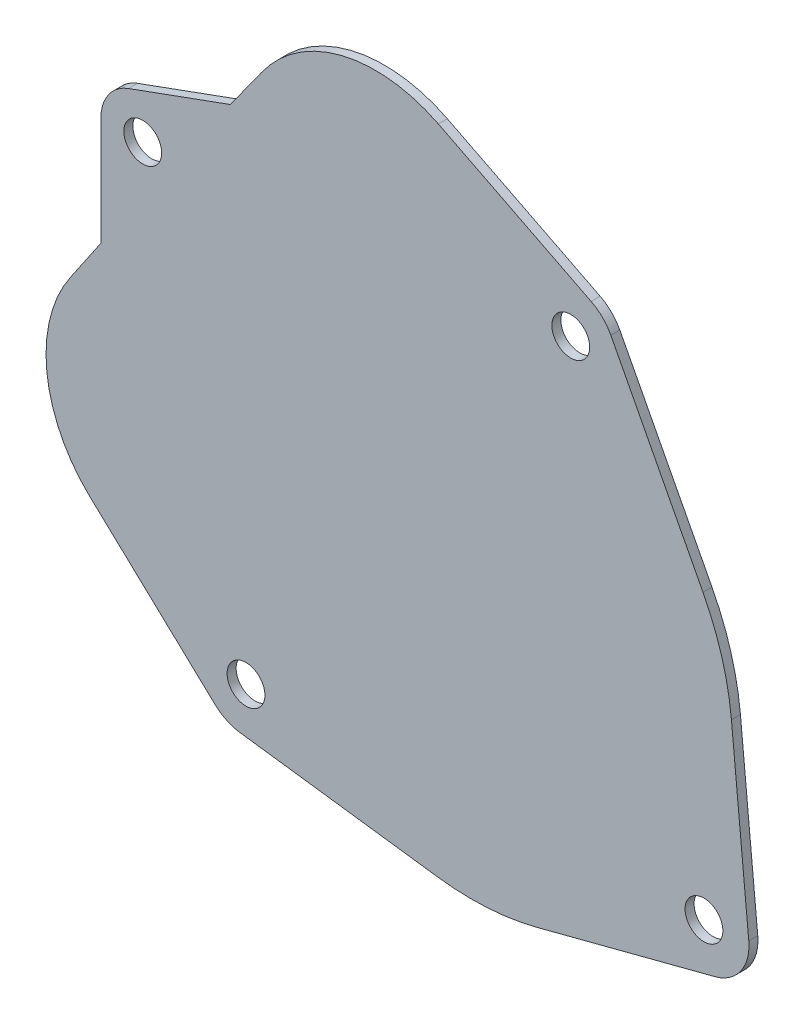
ISO-10303-21;
HEADER;
FILE_DESCRIPTION(('STEP AP214'),'2;1');
FILE_NAME('part.step','',(''),(''),'','','');
FILE_SCHEMA(('AUTOMOTIVE_DESIGN { 1 0 10303 214 1 1 1 1 }'));
ENDSEC;
DATA;
#1=APPLICATION_CONTEXT('core data for automotive mechanical design processes');
#2=APPLICATION_PROTOCOL_DEFINITION('international standard','automotive_design',2000,#1);
#3=PRODUCT_CONTEXT('',#1,'mechanical');
#4=PRODUCT('Part','Part','',(#3));
#5=PRODUCT_RELATED_PRODUCT_CATEGORY('part','',(#4));
#6=PRODUCT_DEFINITION_FORMATION('','',#4);
#7=PRODUCT_DEFINITION_CONTEXT('part definition',#1,'design');
#8=PRODUCT_DEFINITION('design','',#6,#7);
#9=PRODUCT_DEFINITION_SHAPE('','',#8);
#10=(LENGTH_UNIT() NAMED_UNIT(*) SI_UNIT(.MILLI.,.METRE.));
#11=(NAMED_UNIT(*) PLANE_ANGLE_UNIT() SI_UNIT($,.RADIAN.));
#12=(NAMED_UNIT(*) SI_UNIT($,.STERADIAN.) SOLID_ANGLE_UNIT());
#13=UNCERTAINTY_MEASURE_WITH_UNIT(LENGTH_MEASURE(1.E-05),#10,'distance_accuracy_value','');
#14=(GEOMETRIC_REPRESENTATION_CONTEXT(3) GLOBAL_UNCERTAINTY_ASSIGNED_CONTEXT((#13)) GLOBAL_UNIT_ASSIGNED_CONTEXT((#10,
#11,#12)) REPRESENTATION_CONTEXT('',''));
#15=CARTESIAN_POINT('',(0.,0.,0.));
#16=DIRECTION('',(0.,0.,1.));
#17=DIRECTION('',(1.,0.,0.));
#18=AXIS2_PLACEMENT_3D('',#15,#16,#17);
#19=CARTESIAN_POINT('',(-31.7166244267662,17.5170863542468,0.5));
#20=DIRECTION('',(0.,0.,1.));
#21=DIRECTION('',(1.,0.,0.));
#22=AXIS2_PLACEMENT_3D('',#19,#20,#21);
#23=PLANE('',#22);
#24=CARTESIAN_POINT('',(-20.2467719482765,-28.9153870008932,0.5));
#25=DIRECTION('',(0.,0.,1.));
#26=DIRECTION('',(1.,0.,0.));
#27=AXIS2_PLACEMENT_3D('',#24,#25,#26);
#28=CIRCLE('',#27,2.1);
#29=CARTESIAN_POINT('',(-18.1467719482765,-28.9153870008932,0.5));
#30=VERTEX_POINT('',#29);
#31=EDGE_CURVE('E580',#30,#30,#28,.T.);
#32=ORIENTED_EDGE('',*,*,#31,.F.);
#33=EDGE_LOOP('',(#32));
#34=FACE_BOUND('',#33,.T.);
#35=CARTESIAN_POINT('',(15.8385487385144,22.6197918105972,0.5));
#36=DIRECTION('',(0.,0.,1.));
#37=DIRECTION('',(1.,0.,0.));
#38=AXIS2_PLACEMENT_3D('',#35,#36,#37);
#39=CIRCLE('',#38,2.1);
#40=CARTESIAN_POINT('',(17.9385487385144,22.6197918105972,0.5));
#41=VERTEX_POINT('',#40);
#42=EDGE_CURVE('E176',#41,#41,#39,.T.);
#43=ORIENTED_EDGE('',*,*,#42,.F.);
#44=EDGE_LOOP('',(#43));
#45=FACE_BOUND('',#44,.T.);
#46=DIRECTION('',(0.,1.,0.));
#47=VECTOR('',#46,1.);
#48=CARTESIAN_POINT('',(-36.3667741392965,5.46993448608051,0.5));
#49=LINE('',#48,#47);
#50=CARTESIAN_POINT('',(-36.3667741392965,5.46993448608051,0.5));
#51=VERTEX_POINT('',#50);
#52=CARTESIAN_POINT('',(-36.3667741392965,17.5170863542467,0.5));
#53=VERTEX_POINT('',#52);
#54=EDGE_CURVE('E159',#51,#53,#49,.T.);
#55=ORIENTED_EDGE('',*,*,#54,.F.);
#56=DIRECTION('',(0.56326527938096,0.826276119129609,0.));
#57=VECTOR('',#56,1.);
#58=CARTESIAN_POINT('',(-39.6617252587533,0.636440352199778,0.5));
#59=LINE('',#58,#57);
#60=CARTESIAN_POINT('',(-39.6617252587533,0.636440352199778,0.5));
#61=VERTEX_POINT('',#60);
#62=EDGE_CURVE('E165',#61,#51,#59,.T.);
#63=ORIENTED_EDGE('',*,*,#62,.F.);
#64=CARTESIAN_POINT('',(-26.9631728750684,-8.25157221298087,0.5));
#65=DIRECTION('',(0.,0.,1.));
#66=DIRECTION('',(1.,0.,0.));
#67=AXIS2_PLACEMENT_3D('',#64,#65,#66);
#68=CIRCLE('',#67,15.5);
#69=CARTESIAN_POINT('',(-37.5666044594636,-19.5572008392471,0.5));
#70=VERTEX_POINT('',#69);
#71=EDGE_CURVE('E272',#61,#70,#68,.T.);
#72=ORIENTED_EDGE('',*,*,#71,.T.);
#73=DIRECTION('',(0.72939539524298,-0.684092360283563,0.));
#74=VECTOR('',#73,1.);
#75=CARTESIAN_POINT('',(-37.5666044594636,-19.5572008392471,0.5));
#76=LINE('',#75,#74);
#77=CARTESIAN_POINT('',(-23.6826581225442,-32.5788098069176,0.5));
#78=VERTEX_POINT('',#77);
#79=EDGE_CURVE('E269',#70,#78,#76,.T.);
#80=ORIENTED_EDGE('',*,*,#79,.T.);
#81=CARTESIAN_POINT('',(-20.2467719482765,-28.9153870008932,0.5));
#82=DIRECTION('',(0.,0.,-1.));
#83=DIRECTION('',(-1.,0.,0.));
#84=AXIS2_PLACEMENT_3D('',#81,#82,#83);
#85=CIRCLE('',#84,5.02254720816271);
#86=CARTESIAN_POINT('',(-20.907521199013,-33.8942815454557,0.5));
#87=VERTEX_POINT('',#86);
#88=EDGE_CURVE('E266',#87,#78,#85,.T.);
#89=ORIENTED_EDGE('',*,*,#88,.F.);
#90=DIRECTION('',(0.991308660368734,-0.13155660332323,0.));
#91=VECTOR('',#90,1.);
#92=CARTESIAN_POINT('',(-20.907521199013,-33.8942815454557,0.5));
#93=LINE('',#92,#91);
#94=CARTESIAN_POINT('',(1.02816442678642,-36.8053670709498,0.5));
#95=VERTEX_POINT('',#94);
#96=EDGE_CURVE('E263',#87,#95,#93,.T.);
#97=ORIENTED_EDGE('',*,*,#96,.T.);
#98=CARTESIAN_POINT('',(4.84330592316009,-8.05741592025652,0.5));
#99=DIRECTION('',(0.,0.,1.));
#100=DIRECTION('',(1.,0.,0.));
#101=AXIS2_PLACEMENT_3D('',#98,#99,#100);
#102=CIRCLE('',#101,29.);
#103=CARTESIAN_POINT('',(12.1473504856745,-36.1225354287996,0.5));
#104=VERTEX_POINT('',#103);
#105=EDGE_CURVE('E260',#95,#104,#102,.T.);
#106=ORIENTED_EDGE('',*,*,#105,.T.);
#107=DIRECTION('',(-0.967762741673898,-0.251863605603945,0.));
#108=VECTOR('',#107,1.);
#109=CARTESIAN_POINT('',(31.8969354482739,-30.9826375347578,0.5));
#110=LINE('',#109,#108);
#111=CARTESIAN_POINT('',(31.8969354482739,-30.9826375347578,0.5));
#112=VERTEX_POINT('',#111);
#113=EDGE_CURVE('E257',#112,#104,#110,.T.);
#114=ORIENTED_EDGE('',*,*,#113,.F.);
#115=CARTESIAN_POINT('',(30.6376174202542,-26.1438238263883,0.5));
#116=DIRECTION('',(0.,0.,-1.));
#117=DIRECTION('',(-1.,0.,0.));
#118=AXIS2_PLACEMENT_3D('',#115,#116,#117);
#119=CIRCLE('',#118,4.99999999999999);
#120=CARTESIAN_POINT('',(35.6153270878026,-25.6722239264784,0.5));
#121=VERTEX_POINT('',#120);
#122=EDGE_CURVE('E254',#121,#112,#119,.T.);
#123=ORIENTED_EDGE('',*,*,#122,.F.);
#124=DIRECTION('',(-0.0943199799819878,0.995541933509683,0.));
#125=VECTOR('',#124,1.);
#126=CARTESIAN_POINT('',(35.6153270878026,-25.6722239264784,0.5));
#127=LINE('',#126,#125);
#128=CARTESIAN_POINT('',(33.690495330896,-5.35573605913996,0.5));
#129=VERTEX_POINT('',#128);
#130=EDGE_CURVE('E251',#121,#129,#127,.T.);
#131=ORIENTED_EDGE('',*,*,#130,.T.);
#132=CARTESIAN_POINT('',(4.81977925911516,-8.09101547861758,0.5));
#133=DIRECTION('',(0.,0.,-1.));
#134=DIRECTION('',(-1.,0.,0.));
#135=AXIS2_PLACEMENT_3D('',#132,#133,#134);
#136=CIRCLE('',#135,29.);
#137=CARTESIAN_POINT('',(30.529161576738,5.32642320565825,0.5));
#138=VERTEX_POINT('',#137);
#139=EDGE_CURVE('E248',#138,#129,#136,.T.);
#140=ORIENTED_EDGE('',*,*,#139,.F.);
#141=DIRECTION('',(0.462670299457788,-0.886530424745615,0.));
#142=VECTOR('',#141,1.);
#143=CARTESIAN_POINT('',(20.2911896482718,24.9435752314387,0.5));
#144=LINE('',#143,#142);
#145=CARTESIAN_POINT('',(20.2911896482718,24.9435752314387,0.5));
#146=VERTEX_POINT('',#145);
#147=EDGE_CURVE('E245',#146,#138,#144,.T.);
#148=ORIENTED_EDGE('',*,*,#147,.F.);
#149=CARTESIAN_POINT('',(15.8385487385144,22.6197918105972,0.5));
#150=DIRECTION('',(0.,0.,1.));
#151=DIRECTION('',(1.,0.,0.));
#152=AXIS2_PLACEMENT_3D('',#149,#150,#151);
#153=CIRCLE('',#152,5.02254720816271);
#154=CARTESIAN_POINT('',(18.1058978343807,27.1014330875958,0.5));
#155=VERTEX_POINT('',#154);
#156=EDGE_CURVE('E242',#146,#155,#153,.T.);
#157=ORIENTED_EDGE('',*,*,#156,.T.);
#158=DIRECTION('',(0.892304460516565,-0.451434103432873,0.));
#159=VECTOR('',#158,1.);
#160=CARTESIAN_POINT('',(1.12099866062201,35.6944224423331,0.5));
#161=LINE('',#160,#159);
#162=CARTESIAN_POINT('',(1.12099866062201,35.6944224423331,0.5));
#163=VERTEX_POINT('',#162);
#164=EDGE_CURVE('E239',#163,#155,#161,.T.);
#165=ORIENTED_EDGE('',*,*,#164,.F.);
#166=CARTESIAN_POINT('',(-5.87622994258751,21.8637033043264,0.5));
#167=DIRECTION('',(0.,0.,-1.));
#168=DIRECTION('',(-1.,0.,0.));
#169=AXIS2_PLACEMENT_3D('',#166,#167,#168);
#170=CIRCLE('',#169,15.5);
#171=CARTESIAN_POINT('',(-18.5713904698366,30.756559942515,0.5));
#172=VERTEX_POINT('',#171);
#173=EDGE_CURVE('E236',#172,#163,#170,.T.);
#174=ORIENTED_EDGE('',*,*,#173,.F.);
#175=DIRECTION('',(-0.583797500293466,-0.811899303270486,0.));
#176=VECTOR('',#175,1.);
#177=CARTESIAN_POINT('',(-18.5713904698366,30.756559942515,0.5));
#178=LINE('',#177,#176);
#179=CARTESIAN_POINT('',(-21.9864495859286,26.0071663332775,0.5));
#180=VERTEX_POINT('',#179);
#181=EDGE_CURVE('E233',#172,#180,#178,.T.);
#182=ORIENTED_EDGE('',*,*,#181,.T.);
#183=DIRECTION('',(-0.939692620785909,-0.342020143325666,0.));
#184=VECTOR('',#183,1.);
#185=CARTESIAN_POINT('',(-21.9864495859286,26.0071663332775,0.5));
#186=LINE('',#185,#184);
#187=CARTESIAN_POINT('',(-33.3070692979316,21.8867977246612,0.5));
#188=VERTEX_POINT('',#187);
#189=EDGE_CURVE('E230',#180,#188,#186,.T.);
#190=ORIENTED_EDGE('',*,*,#189,.T.);
#191=CARTESIAN_POINT('',(-31.7166244267662,17.5170863542468,0.5));
#192=DIRECTION('',(0.,0.,1.));
#193=DIRECTION('',(1.,0.,0.));
#194=AXIS2_PLACEMENT_3D('',#191,#192,#193);
#195=CIRCLE('',#194,4.65014971253034);
#196=EDGE_CURVE('E228',#188,#53,#195,.T.);
#197=ORIENTED_EDGE('',*,*,#196,.T.);
#198=EDGE_LOOP('',(#55,#63,#72,#80,#89,#97,#106,#114,#123,#131,#140,#148,#157,#165,#174,#182,
#190,#197));
#199=FACE_BOUND('',#198,.T.);
#200=CARTESIAN_POINT('',(-31.7166244267662,17.5170863542468,0.5));
#201=DIRECTION('',(0.,0.,1.));
#202=DIRECTION('',(1.,0.,0.));
#203=AXIS2_PLACEMENT_3D('',#200,#201,#202);
#204=CIRCLE('',#203,2.1);
#205=CARTESIAN_POINT('',(-29.6166244267662,17.5170863542468,0.5));
#206=VERTEX_POINT('',#205);
#207=EDGE_CURVE('E586',#206,#206,#204,.T.);
#208=ORIENTED_EDGE('',*,*,#207,.F.);
#209=EDGE_LOOP('',(#208));
#210=FACE_BOUND('',#209,.T.);
#211=CARTESIAN_POINT('',(30.6376174202542,-26.1438238263883,0.5));
#212=DIRECTION('',(0.,0.,1.));
#213=DIRECTION('',(1.,0.,0.));
#214=AXIS2_PLACEMENT_3D('',#211,#212,#213);
#215=CIRCLE('',#214,2.1);
#216=CARTESIAN_POINT('',(32.7376174202542,-26.1438238263883,0.5));
#217=VERTEX_POINT('',#216);
#218=EDGE_CURVE('E569',#217,#217,#215,.T.);
#219=ORIENTED_EDGE('',*,*,#218,.F.);
#220=EDGE_LOOP('',(#219));
#221=FACE_BOUND('',#220,.T.);
#222=ADVANCED_FACE('F33',(#34,#45,#199,#210,#221),#23,.T.);
#223=CARTESIAN_POINT('',(-31.7166244267662,17.5170863542468,-0.5));
#224=DIRECTION('',(0.,0.,1.));
#225=DIRECTION('',(1.,0.,0.));
#226=AXIS2_PLACEMENT_3D('',#223,#224,#225);
#227=PLANE('',#226);
#228=CARTESIAN_POINT('',(-20.2467719482765,-28.9153870008932,-0.5));
#229=DIRECTION('',(0.,0.,1.));
#230=DIRECTION('',(1.,0.,0.));
#231=AXIS2_PLACEMENT_3D('',#228,#229,#230);
#232=CIRCLE('',#231,2.1);
#233=CARTESIAN_POINT('',(-18.1467719482765,-28.9153870008932,-0.5));
#234=VERTEX_POINT('',#233);
#235=EDGE_CURVE('E575',#234,#234,#232,.T.);
#236=ORIENTED_EDGE('',*,*,#235,.T.);
#237=EDGE_LOOP('',(#236));
#238=FACE_BOUND('',#237,.T.);
#239=CARTESIAN_POINT('',(15.8385487385144,22.6197918105972,-0.5));
#240=DIRECTION('',(0.,0.,1.));
#241=DIRECTION('',(1.,0.,0.));
#242=AXIS2_PLACEMENT_3D('',#239,#240,#241);
#243=CIRCLE('',#242,2.1);
#244=CARTESIAN_POINT('',(17.9385487385144,22.6197918105972,-0.5));
#245=VERTEX_POINT('',#244);
#246=EDGE_CURVE('E589',#245,#245,#243,.T.);
#247=ORIENTED_EDGE('',*,*,#246,.T.);
#248=EDGE_LOOP('',(#247));
#249=FACE_BOUND('',#248,.T.);
#250=DIRECTION('',(0.,1.,0.));
#251=VECTOR('',#250,1.);
#252=CARTESIAN_POINT('',(-36.3667741392965,5.46993448608051,-0.5));
#253=LINE('',#252,#251);
#254=CARTESIAN_POINT('',(-36.3667741392965,5.46993448608051,-0.5));
#255=VERTEX_POINT('',#254);
#256=CARTESIAN_POINT('',(-36.3667741392965,17.5170863542467,-0.5));
#257=VERTEX_POINT('',#256);
#258=EDGE_CURVE('E157',#255,#257,#253,.T.);
#259=ORIENTED_EDGE('',*,*,#258,.T.);
#260=CARTESIAN_POINT('',(-31.7166244267662,17.5170863542468,-0.5));
#261=DIRECTION('',(0.,0.,1.));
#262=DIRECTION('',(1.,0.,0.));
#263=AXIS2_PLACEMENT_3D('',#260,#261,#262);
#264=CIRCLE('',#263,4.65014971253034);
#265=CARTESIAN_POINT('',(-33.3070692979316,21.8867977246612,-0.5));
#266=VERTEX_POINT('',#265);
#267=EDGE_CURVE('E172',#266,#257,#264,.T.);
#268=ORIENTED_EDGE('',*,*,#267,.F.);
#269=DIRECTION('',(-0.939692620785909,-0.342020143325666,0.));
#270=VECTOR('',#269,1.);
#271=CARTESIAN_POINT('',(-21.9864495859286,26.0071663332775,-0.5));
#272=LINE('',#271,#270);
#273=CARTESIAN_POINT('',(-21.9864495859286,26.0071663332775,-0.5));
#274=VERTEX_POINT('',#273);
#275=EDGE_CURVE('E179',#274,#266,#272,.T.);
#276=ORIENTED_EDGE('',*,*,#275,.F.);
#277=DIRECTION('',(-0.583797500293466,-0.811899303270486,0.));
#278=VECTOR('',#277,1.);
#279=CARTESIAN_POINT('',(-18.5713904698366,30.756559942515,-0.5));
#280=LINE('',#279,#278);
#281=CARTESIAN_POINT('',(-18.5713904698366,30.756559942515,-0.5));
#282=VERTEX_POINT('',#281);
#283=EDGE_CURVE('E181',#282,#274,#280,.T.);
#284=ORIENTED_EDGE('',*,*,#283,.F.);
#285=CARTESIAN_POINT('',(-5.87622994258751,21.8637033043264,-0.5));
#286=DIRECTION('',(0.,0.,-1.));
#287=DIRECTION('',(-1.,0.,0.));
#288=AXIS2_PLACEMENT_3D('',#285,#286,#287);
#289=CIRCLE('',#288,15.5);
#290=CARTESIAN_POINT('',(1.12099866062201,35.6944224423331,-0.5));
#291=VERTEX_POINT('',#290);
#292=EDGE_CURVE('E187',#282,#291,#289,.T.);
#293=ORIENTED_EDGE('',*,*,#292,.T.);
#294=DIRECTION('',(0.892304460516565,-0.451434103432873,0.));
#295=VECTOR('',#294,1.);
#296=CARTESIAN_POINT('',(1.12099866062201,35.6944224423331,-0.5));
#297=LINE('',#296,#295);
#298=CARTESIAN_POINT('',(18.1058978343807,27.1014330875958,-0.5));
#299=VERTEX_POINT('',#298);
#300=EDGE_CURVE('E190',#291,#299,#297,.T.);
#301=ORIENTED_EDGE('',*,*,#300,.T.);
#302=CARTESIAN_POINT('',(15.8385487385144,22.6197918105972,-0.5));
#303=DIRECTION('',(0.,0.,1.));
#304=DIRECTION('',(1.,0.,0.));
#305=AXIS2_PLACEMENT_3D('',#302,#303,#304);
#306=CIRCLE('',#305,5.02254720816271);
#307=CARTESIAN_POINT('',(20.2911896482718,24.9435752314387,-0.5));
#308=VERTEX_POINT('',#307);
#309=EDGE_CURVE('E193',#308,#299,#306,.T.);
#310=ORIENTED_EDGE('',*,*,#309,.F.);
#311=DIRECTION('',(0.462670299457788,-0.886530424745615,0.));
#312=VECTOR('',#311,1.);
#313=CARTESIAN_POINT('',(20.2911896482718,24.9435752314387,-0.5));
#314=LINE('',#313,#312);
#315=CARTESIAN_POINT('',(30.529161576738,5.32642320565825,-0.5));
#316=VERTEX_POINT('',#315);
#317=EDGE_CURVE('E196',#308,#316,#314,.T.);
#318=ORIENTED_EDGE('',*,*,#317,.T.);
#319=CARTESIAN_POINT('',(4.81977925911516,-8.09101547861758,-0.5));
#320=DIRECTION('',(0.,0.,-1.));
#321=DIRECTION('',(-1.,0.,0.));
#322=AXIS2_PLACEMENT_3D('',#319,#320,#321);
#323=CIRCLE('',#322,29.);
#324=CARTESIAN_POINT('',(33.690495330896,-5.35573605913996,-0.5));
#325=VERTEX_POINT('',#324);
#326=EDGE_CURVE('E199',#316,#325,#323,.T.);
#327=ORIENTED_EDGE('',*,*,#326,.T.);
#328=DIRECTION('',(-0.0943199799819878,0.995541933509683,0.));
#329=VECTOR('',#328,1.);
#330=CARTESIAN_POINT('',(35.6153270878026,-25.6722239264784,-0.5));
#331=LINE('',#330,#329);
#332=CARTESIAN_POINT('',(35.6153270878026,-25.6722239264784,-0.5));
#333=VERTEX_POINT('',#332);
#334=EDGE_CURVE('E202',#333,#325,#331,.T.);
#335=ORIENTED_EDGE('',*,*,#334,.F.);
#336=CARTESIAN_POINT('',(30.6376174202542,-26.1438238263883,-0.5));
#337=DIRECTION('',(0.,0.,-1.));
#338=DIRECTION('',(-1.,0.,0.));
#339=AXIS2_PLACEMENT_3D('',#336,#337,#338);
#340=CIRCLE('',#339,4.99999999999999);
#341=CARTESIAN_POINT('',(31.8969354482739,-30.9826375347578,-0.5));
#342=VERTEX_POINT('',#341);
#343=EDGE_CURVE('E205',#333,#342,#340,.T.);
#344=ORIENTED_EDGE('',*,*,#343,.T.);
#345=DIRECTION('',(-0.967762741673898,-0.251863605603945,0.));
#346=VECTOR('',#345,1.);
#347=CARTESIAN_POINT('',(31.8969354482739,-30.9826375347578,-0.5));
#348=LINE('',#347,#346);
#349=CARTESIAN_POINT('',(12.1473504856745,-36.1225354287996,-0.5));
#350=VERTEX_POINT('',#349);
#351=EDGE_CURVE('E208',#342,#350,#348,.T.);
#352=ORIENTED_EDGE('',*,*,#351,.T.);
#353=CARTESIAN_POINT('',(4.84330592316009,-8.05741592025652,-0.5));
#354=DIRECTION('',(0.,0.,1.));
#355=DIRECTION('',(1.,0.,0.));
#356=AXIS2_PLACEMENT_3D('',#353,#354,#355);
#357=CIRCLE('',#356,29.);
#358=CARTESIAN_POINT('',(1.02816442678642,-36.8053670709498,-0.5));
#359=VERTEX_POINT('',#358);
#360=EDGE_CURVE('E211',#359,#350,#357,.T.);
#361=ORIENTED_EDGE('',*,*,#360,.F.);
#362=DIRECTION('',(0.991308660368734,-0.13155660332323,0.));
#363=VECTOR('',#362,1.);
#364=CARTESIAN_POINT('',(-20.907521199013,-33.8942815454557,-0.5));
#365=LINE('',#364,#363);
#366=CARTESIAN_POINT('',(-20.907521199013,-33.8942815454557,-0.5));
#367=VERTEX_POINT('',#366);
#368=EDGE_CURVE('E214',#367,#359,#365,.T.);
#369=ORIENTED_EDGE('',*,*,#368,.F.);
#370=CARTESIAN_POINT('',(-20.2467719482765,-28.9153870008932,-0.5));
#371=DIRECTION('',(0.,0.,-1.));
#372=DIRECTION('',(-1.,0.,0.));
#373=AXIS2_PLACEMENT_3D('',#370,#371,#372);
#374=CIRCLE('',#373,5.02254720816271);
#375=CARTESIAN_POINT('',(-23.6826581225442,-32.5788098069176,-0.5));
#376=VERTEX_POINT('',#375);
#377=EDGE_CURVE('E217',#367,#376,#374,.T.);
#378=ORIENTED_EDGE('',*,*,#377,.T.);
#379=DIRECTION('',(0.72939539524298,-0.684092360283563,0.));
#380=VECTOR('',#379,1.);
#381=CARTESIAN_POINT('',(-37.5666044594636,-19.5572008392471,-0.5));
#382=LINE('',#381,#380);
#383=CARTESIAN_POINT('',(-37.5666044594636,-19.5572008392471,-0.5));
#384=VERTEX_POINT('',#383);
#385=EDGE_CURVE('E220',#384,#376,#382,.T.);
#386=ORIENTED_EDGE('',*,*,#385,.F.);
#387=CARTESIAN_POINT('',(-26.9631728750684,-8.25157221298087,-0.5));
#388=DIRECTION('',(0.,0.,1.));
#389=DIRECTION('',(1.,0.,0.));
#390=AXIS2_PLACEMENT_3D('',#387,#388,#389);
#391=CIRCLE('',#390,15.5);
#392=CARTESIAN_POINT('',(-39.6617252587533,0.636440352199778,-0.5));
#393=VERTEX_POINT('',#392);
#394=EDGE_CURVE('E223',#393,#384,#391,.T.);
#395=ORIENTED_EDGE('',*,*,#394,.F.);
#396=DIRECTION('',(0.56326527938096,0.826276119129609,0.));
#397=VECTOR('',#396,1.);
#398=CARTESIAN_POINT('',(-39.6617252587533,0.636440352199778,-0.5));
#399=LINE('',#398,#397);
#400=EDGE_CURVE('E175',#393,#255,#399,.T.);
#401=ORIENTED_EDGE('',*,*,#400,.T.);
#402=EDGE_LOOP('',(#259,#268,#276,#284,#293,#301,#310,#318,#327,#335,#344,#352,#361,#369,#378,
#386,#395,#401));
#403=FACE_BOUND('',#402,.T.);
#404=CARTESIAN_POINT('',(-31.7166244267662,17.5170863542468,-0.5));
#405=DIRECTION('',(0.,0.,1.));
#406=DIRECTION('',(1.,0.,0.));
#407=AXIS2_PLACEMENT_3D('',#404,#405,#406);
#408=CIRCLE('',#407,2.1);
#409=CARTESIAN_POINT('',(-29.6166244267662,17.5170863542468,-0.5));
#410=VERTEX_POINT('',#409);
#411=EDGE_CURVE('E583',#410,#410,#408,.T.);
#412=ORIENTED_EDGE('',*,*,#411,.T.);
#413=EDGE_LOOP('',(#412));
#414=FACE_BOUND('',#413,.T.);
#415=CARTESIAN_POINT('',(30.6376174202542,-26.1438238263883,-0.5));
#416=DIRECTION('',(0.,0.,1.));
#417=DIRECTION('',(1.,0.,0.));
#418=AXIS2_PLACEMENT_3D('',#415,#416,#417);
#419=CIRCLE('',#418,2.1);
#420=CARTESIAN_POINT('',(32.7376174202542,-26.1438238263883,-0.5));
#421=VERTEX_POINT('',#420);
#422=EDGE_CURVE('E572',#421,#421,#419,.T.);
#423=ORIENTED_EDGE('',*,*,#422,.T.);
#424=EDGE_LOOP('',(#423));
#425=FACE_BOUND('',#424,.T.);
#426=ADVANCED_FACE('F169',(#238,#249,#403,#414,#425),#227,.F.);
#427=CARTESIAN_POINT('',(-36.3667741392965,5.46993448608051,0.5));
#428=DIRECTION('',(-1.,0.,0.));
#429=DIRECTION('',(0.,-1.,0.));
#430=AXIS2_PLACEMENT_3D('',#427,#428,#429);
#431=PLANE('',#430);
#432=DIRECTION('',(0.,0.,-1.));
#433=VECTOR('',#432,1.);
#434=CARTESIAN_POINT('',(-36.3667741392965,5.46993448608051,0.5));
#435=LINE('',#434,#433);
#436=EDGE_CURVE('E11',#51,#255,#435,.T.);
#437=ORIENTED_EDGE('',*,*,#436,.F.);
#438=ORIENTED_EDGE('',*,*,#54,.T.);
#439=DIRECTION('',(0.,0.,-1.));
#440=VECTOR('',#439,1.);
#441=CARTESIAN_POINT('',(-36.3667741392965,17.5170863542467,0.5));
#442=LINE('',#441,#440);
#443=EDGE_CURVE('E154',#53,#257,#442,.T.);
#444=ORIENTED_EDGE('',*,*,#443,.T.);
#445=ORIENTED_EDGE('',*,*,#258,.F.);
#446=EDGE_LOOP('',(#437,#438,#444,#445));
#447=FACE_BOUND('',#446,.T.);
#448=ADVANCED_FACE('F156',(#447),#431,.T.);
#449=CARTESIAN_POINT('',(-39.6617252587533,0.636440352199778,0.5));
#450=DIRECTION('',(-0.826276119129609,0.56326527938096,0.));
#451=DIRECTION('',(-0.56326527938096,-0.82627611912961,0.));
#452=AXIS2_PLACEMENT_3D('',#449,#450,#451);
#453=PLANE('',#452);
#454=DIRECTION('',(0.,0.,-1.));
#455=VECTOR('',#454,1.);
#456=CARTESIAN_POINT('',(-39.6617252587533,0.636440352199778,0.5));
#457=LINE('',#456,#455);
#458=EDGE_CURVE('E41',#61,#393,#457,.T.);
#459=ORIENTED_EDGE('',*,*,#458,.F.);
#460=ORIENTED_EDGE('',*,*,#62,.T.);
#461=ORIENTED_EDGE('',*,*,#436,.T.);
#462=ORIENTED_EDGE('',*,*,#400,.F.);
#463=EDGE_LOOP('',(#459,#460,#461,#462));
#464=FACE_BOUND('',#463,.T.);
#465=ADVANCED_FACE('F35',(#464),#453,.T.);
#466=CARTESIAN_POINT('',(-26.9631728750684,-8.25157221298087,0.5));
#467=DIRECTION('',(0.,0.,-1.));
#468=DIRECTION('',(-1.,0.,0.));
#469=AXIS2_PLACEMENT_3D('',#466,#467,#468);
#470=CYLINDRICAL_SURFACE('',#469,15.5);
#471=DIRECTION('',(0.,0.,-1.));
#472=VECTOR('',#471,1.);
#473=CARTESIAN_POINT('',(-37.5666044594636,-19.5572008392471,0.5));
#474=LINE('',#473,#472);
#475=EDGE_CURVE('E303',#70,#384,#474,.T.);
#476=ORIENTED_EDGE('',*,*,#475,.F.);
#477=ORIENTED_EDGE('',*,*,#71,.F.);
#478=ORIENTED_EDGE('',*,*,#458,.T.);
#479=ORIENTED_EDGE('',*,*,#394,.T.);
#480=EDGE_LOOP('',(#476,#477,#478,#479));
#481=FACE_BOUND('',#480,.T.);
#482=ADVANCED_FACE('F305',(#481),#470,.T.);
#483=CARTESIAN_POINT('',(-37.5666044594636,-19.5572008392471,0.5));
#484=DIRECTION('',(0.684092360283563,0.72939539524298,0.));
#485=DIRECTION('',(-0.72939539524298,0.684092360283563,0.));
#486=AXIS2_PLACEMENT_3D('',#483,#484,#485);
#487=PLANE('',#486);
#488=DIRECTION('',(0.,0.,-1.));
#489=VECTOR('',#488,1.);
#490=CARTESIAN_POINT('',(-23.6826581225442,-32.5788098069176,0.5));
#491=LINE('',#490,#489);
#492=EDGE_CURVE('E301',#78,#376,#491,.T.);
#493=ORIENTED_EDGE('',*,*,#492,.F.);
#494=ORIENTED_EDGE('',*,*,#79,.F.);
#495=ORIENTED_EDGE('',*,*,#475,.T.);
#496=ORIENTED_EDGE('',*,*,#385,.T.);
#497=EDGE_LOOP('',(#493,#494,#495,#496));
#498=FACE_BOUND('',#497,.T.);
#499=ADVANCED_FACE('F362',(#498),#487,.F.);
#500=CARTESIAN_POINT('',(-20.2467719482765,-28.9153870008932,0.5));
#501=DIRECTION('',(0.,0.,-1.));
#502=DIRECTION('',(-1.,0.,0.));
#503=AXIS2_PLACEMENT_3D('',#500,#501,#502);
#504=CYLINDRICAL_SURFACE('',#503,5.02254720816271);
#505=DIRECTION('',(0.,0.,-1.));
#506=VECTOR('',#505,1.);
#507=CARTESIAN_POINT('',(-20.907521199013,-33.8942815454557,0.5));
#508=LINE('',#507,#506);
#509=EDGE_CURVE('E299',#87,#367,#508,.T.);
#510=ORIENTED_EDGE('',*,*,#509,.F.);
#511=ORIENTED_EDGE('',*,*,#88,.T.);
#512=ORIENTED_EDGE('',*,*,#492,.T.);
#513=ORIENTED_EDGE('',*,*,#377,.F.);
#514=EDGE_LOOP('',(#510,#511,#512,#513));
#515=FACE_BOUND('',#514,.T.);
#516=ADVANCED_FACE('F360',(#515),#504,.T.);
#517=CARTESIAN_POINT('',(-20.907521199013,-33.8942815454557,0.5));
#518=DIRECTION('',(0.13155660332323,0.991308660368734,0.));
#519=DIRECTION('',(-0.991308660368734,0.13155660332323,0.));
#520=AXIS2_PLACEMENT_3D('',#517,#518,#519);
#521=PLANE('',#520);
#522=DIRECTION('',(0.,0.,-1.));
#523=VECTOR('',#522,1.);
#524=CARTESIAN_POINT('',(1.02816442678642,-36.8053670709498,0.5));
#525=LINE('',#524,#523);
#526=EDGE_CURVE('E297',#95,#359,#525,.T.);
#527=ORIENTED_EDGE('',*,*,#526,.F.);
#528=ORIENTED_EDGE('',*,*,#96,.F.);
#529=ORIENTED_EDGE('',*,*,#509,.T.);
#530=ORIENTED_EDGE('',*,*,#368,.T.);
#531=EDGE_LOOP('',(#527,#528,#529,#530));
#532=FACE_BOUND('',#531,.T.);
#533=ADVANCED_FACE('F356',(#532),#521,.F.);
#534=CARTESIAN_POINT('',(4.84330592316009,-8.05741592025652,0.5));
#535=DIRECTION('',(0.,0.,-1.));
#536=DIRECTION('',(-1.,0.,0.));
#537=AXIS2_PLACEMENT_3D('',#534,#535,#536);
#538=CYLINDRICAL_SURFACE('',#537,29.);
#539=DIRECTION('',(0.,0.,-1.));
#540=VECTOR('',#539,1.);
#541=CARTESIAN_POINT('',(12.1473504856745,-36.1225354287996,0.5));
#542=LINE('',#541,#540);
#543=EDGE_CURVE('E295',#104,#350,#542,.T.);
#544=ORIENTED_EDGE('',*,*,#543,.F.);
#545=ORIENTED_EDGE('',*,*,#105,.F.);
#546=ORIENTED_EDGE('',*,*,#526,.T.);
#547=ORIENTED_EDGE('',*,*,#360,.T.);
#548=EDGE_LOOP('',(#544,#545,#546,#547));
#549=FACE_BOUND('',#548,.T.);
#550=ADVANCED_FACE('F352',(#549),#538,.T.);
#551=CARTESIAN_POINT('',(31.8969354482739,-30.9826375347578,0.5));
#552=DIRECTION('',(0.251863605603945,-0.967762741673898,0.));
#553=DIRECTION('',(0.967762741673898,0.251863605603945,0.));
#554=AXIS2_PLACEMENT_3D('',#551,#552,#553);
#555=PLANE('',#554);
#556=DIRECTION('',(0.,0.,-1.));
#557=VECTOR('',#556,1.);
#558=CARTESIAN_POINT('',(31.8969354482739,-30.9826375347578,0.5));
#559=LINE('',#558,#557);
#560=EDGE_CURVE('E293',#112,#342,#559,.T.);
#561=ORIENTED_EDGE('',*,*,#560,.F.);
#562=ORIENTED_EDGE('',*,*,#113,.T.);
#563=ORIENTED_EDGE('',*,*,#543,.T.);
#564=ORIENTED_EDGE('',*,*,#351,.F.);
#565=EDGE_LOOP('',(#561,#562,#563,#564));
#566=FACE_BOUND('',#565,.T.);
#567=ADVANCED_FACE('F349',(#566),#555,.T.);
#568=CARTESIAN_POINT('',(30.6376174202542,-26.1438238263883,0.5));
#569=DIRECTION('',(0.,0.,-1.));
#570=DIRECTION('',(-1.,0.,0.));
#571=AXIS2_PLACEMENT_3D('',#568,#569,#570);
#572=CYLINDRICAL_SURFACE('',#571,4.99999999999999);
#573=DIRECTION('',(0.,0.,-1.));
#574=VECTOR('',#573,1.);
#575=CARTESIAN_POINT('',(35.6153270878026,-25.6722239264784,0.5));
#576=LINE('',#575,#574);
#577=EDGE_CURVE('E291',#121,#333,#576,.T.);
#578=ORIENTED_EDGE('',*,*,#577,.F.);
#579=ORIENTED_EDGE('',*,*,#122,.T.);
#580=ORIENTED_EDGE('',*,*,#560,.T.);
#581=ORIENTED_EDGE('',*,*,#343,.F.);
#582=EDGE_LOOP('',(#578,#579,#580,#581));
#583=FACE_BOUND('',#582,.T.);
#584=ADVANCED_FACE('F344',(#583),#572,.T.);
#585=CARTESIAN_POINT('',(35.6153270878026,-25.6722239264784,0.5));
#586=DIRECTION('',(-0.995541933509683,-0.0943199799819878,0.));
#587=DIRECTION('',(0.0943199799819878,-0.995541933509683,0.));
#588=AXIS2_PLACEMENT_3D('',#585,#586,#587);
#589=PLANE('',#588);
#590=DIRECTION('',(0.,0.,-1.));
#591=VECTOR('',#590,1.);
#592=CARTESIAN_POINT('',(33.690495330896,-5.35573605913996,0.5));
#593=LINE('',#592,#591);
#594=EDGE_CURVE('E289',#129,#325,#593,.T.);
#595=ORIENTED_EDGE('',*,*,#594,.F.);
#596=ORIENTED_EDGE('',*,*,#130,.F.);
#597=ORIENTED_EDGE('',*,*,#577,.T.);
#598=ORIENTED_EDGE('',*,*,#334,.T.);
#599=EDGE_LOOP('',(#595,#596,#597,#598));
#600=FACE_BOUND('',#599,.T.);
#601=ADVANCED_FACE('F340',(#600),#589,.F.);
#602=CARTESIAN_POINT('',(4.81977925911516,-8.09101547861758,0.5));
#603=DIRECTION('',(0.,0.,-1.));
#604=DIRECTION('',(-1.,0.,0.));
#605=AXIS2_PLACEMENT_3D('',#602,#603,#604);
#606=CYLINDRICAL_SURFACE('',#605,29.);
#607=DIRECTION('',(0.,0.,-1.));
#608=VECTOR('',#607,1.);
#609=CARTESIAN_POINT('',(30.529161576738,5.32642320565825,0.5));
#610=LINE('',#609,#608);
#611=EDGE_CURVE('E287',#138,#316,#610,.T.);
#612=ORIENTED_EDGE('',*,*,#611,.F.);
#613=ORIENTED_EDGE('',*,*,#139,.T.);
#614=ORIENTED_EDGE('',*,*,#594,.T.);
#615=ORIENTED_EDGE('',*,*,#326,.F.);
#616=EDGE_LOOP('',(#612,#613,#614,#615));
#617=FACE_BOUND('',#616,.T.);
#618=ADVANCED_FACE('F336',(#617),#606,.T.);
#619=CARTESIAN_POINT('',(20.2911896482718,24.9435752314387,0.5));
#620=DIRECTION('',(0.886530424745615,0.462670299457788,0.));
#621=DIRECTION('',(-0.462670299457788,0.886530424745615,0.));
#622=AXIS2_PLACEMENT_3D('',#619,#620,#621);
#623=PLANE('',#622);
#624=DIRECTION('',(0.,0.,-1.));
#625=VECTOR('',#624,1.);
#626=CARTESIAN_POINT('',(20.2911896482718,24.9435752314387,0.5));
#627=LINE('',#626,#625);
#628=EDGE_CURVE('E285',#146,#308,#627,.T.);
#629=ORIENTED_EDGE('',*,*,#628,.F.);
#630=ORIENTED_EDGE('',*,*,#147,.T.);
#631=ORIENTED_EDGE('',*,*,#611,.T.);
#632=ORIENTED_EDGE('',*,*,#317,.F.);
#633=EDGE_LOOP('',(#629,#630,#631,#632));
#634=FACE_BOUND('',#633,.T.);
#635=ADVANCED_FACE('F333',(#634),#623,.T.);
#636=CARTESIAN_POINT('',(15.8385487385144,22.6197918105972,0.5));
#637=DIRECTION('',(0.,0.,-1.));
#638=DIRECTION('',(-1.,0.,0.));
#639=AXIS2_PLACEMENT_3D('',#636,#637,#638);
#640=CYLINDRICAL_SURFACE('',#639,5.02254720816271);
#641=DIRECTION('',(0.,0.,-1.));
#642=VECTOR('',#641,1.);
#643=CARTESIAN_POINT('',(18.1058978343807,27.1014330875958,0.5));
#644=LINE('',#643,#642);
#645=EDGE_CURVE('E283',#155,#299,#644,.T.);
#646=ORIENTED_EDGE('',*,*,#645,.F.);
#647=ORIENTED_EDGE('',*,*,#156,.F.);
#648=ORIENTED_EDGE('',*,*,#628,.T.);
#649=ORIENTED_EDGE('',*,*,#309,.T.);
#650=EDGE_LOOP('',(#646,#647,#648,#649));
#651=FACE_BOUND('',#650,.T.);
#652=ADVANCED_FACE('F328',(#651),#640,.T.);
#653=CARTESIAN_POINT('',(1.12099866062201,35.6944224423331,0.5));
#654=DIRECTION('',(0.451434103432873,0.892304460516565,0.));
#655=DIRECTION('',(-0.892304460516565,0.451434103432873,0.));
#656=AXIS2_PLACEMENT_3D('',#653,#654,#655);
#657=PLANE('',#656);
#658=DIRECTION('',(0.,0.,-1.));
#659=VECTOR('',#658,1.);
#660=CARTESIAN_POINT('',(1.12099866062201,35.6944224423331,0.5));
#661=LINE('',#660,#659);
#662=EDGE_CURVE('E281',#163,#291,#661,.T.);
#663=ORIENTED_EDGE('',*,*,#662,.F.);
#664=ORIENTED_EDGE('',*,*,#164,.T.);
#665=ORIENTED_EDGE('',*,*,#645,.T.);
#666=ORIENTED_EDGE('',*,*,#300,.F.);
#667=EDGE_LOOP('',(#663,#664,#665,#666));
#668=FACE_BOUND('',#667,.T.);
#669=ADVANCED_FACE('F325',(#668),#657,.T.);
#670=CARTESIAN_POINT('',(-5.87622994258751,21.8637033043264,0.5));
#671=DIRECTION('',(0.,0.,-1.));
#672=DIRECTION('',(-1.,0.,0.));
#673=AXIS2_PLACEMENT_3D('',#670,#671,#672);
#674=CYLINDRICAL_SURFACE('',#673,15.5);
#675=DIRECTION('',(0.,0.,-1.));
#676=VECTOR('',#675,1.);
#677=CARTESIAN_POINT('',(-18.5713904698366,30.756559942515,0.5));
#678=LINE('',#677,#676);
#679=EDGE_CURVE('E279',#172,#282,#678,.T.);
#680=ORIENTED_EDGE('',*,*,#679,.F.);
#681=ORIENTED_EDGE('',*,*,#173,.T.);
#682=ORIENTED_EDGE('',*,*,#662,.T.);
#683=ORIENTED_EDGE('',*,*,#292,.F.);
#684=EDGE_LOOP('',(#680,#681,#682,#683));
#685=FACE_BOUND('',#684,.T.);
#686=ADVANCED_FACE('F320',(#685),#674,.T.);
#687=CARTESIAN_POINT('',(-18.5713904698366,30.756559942515,0.5));
#688=DIRECTION('',(0.811899303270486,-0.583797500293466,0.));
#689=DIRECTION('',(0.583797500293466,0.811899303270486,0.));
#690=AXIS2_PLACEMENT_3D('',#687,#688,#689);
#691=PLANE('',#690);
#692=DIRECTION('',(0.,0.,-1.));
#693=VECTOR('',#692,1.);
#694=CARTESIAN_POINT('',(-21.9864495859286,26.0071663332775,0.5));
#695=LINE('',#694,#693);
#696=EDGE_CURVE('E277',#180,#274,#695,.T.);
#697=ORIENTED_EDGE('',*,*,#696,.F.);
#698=ORIENTED_EDGE('',*,*,#181,.F.);
#699=ORIENTED_EDGE('',*,*,#679,.T.);
#700=ORIENTED_EDGE('',*,*,#283,.T.);
#701=EDGE_LOOP('',(#697,#698,#699,#700));
#702=FACE_BOUND('',#701,.T.);
#703=ADVANCED_FACE('F318',(#702),#691,.F.);
#704=CARTESIAN_POINT('',(-21.9864495859286,26.0071663332775,0.5));
#705=DIRECTION('',(0.342020143325666,-0.939692620785909,0.));
#706=DIRECTION('',(0.939692620785909,0.342020143325666,0.));
#707=AXIS2_PLACEMENT_3D('',#704,#705,#706);
#708=PLANE('',#707);
#709=DIRECTION('',(0.,0.,-1.));
#710=VECTOR('',#709,1.);
#711=CARTESIAN_POINT('',(-33.3070692979316,21.8867977246612,0.5));
#712=LINE('',#711,#710);
#713=EDGE_CURVE('E164',#188,#266,#712,.T.);
#714=ORIENTED_EDGE('',*,*,#713,.F.);
#715=ORIENTED_EDGE('',*,*,#189,.F.);
#716=ORIENTED_EDGE('',*,*,#696,.T.);
#717=ORIENTED_EDGE('',*,*,#275,.T.);
#718=EDGE_LOOP('',(#714,#715,#716,#717));
#719=FACE_BOUND('',#718,.T.);
#720=ADVANCED_FACE('F314',(#719),#708,.F.);
#721=CARTESIAN_POINT('',(-31.7166244267662,17.5170863542468,0.5));
#722=DIRECTION('',(0.,0.,-1.));
#723=DIRECTION('',(-1.,0.,0.));
#724=AXIS2_PLACEMENT_3D('',#721,#722,#723);
#725=CYLINDRICAL_SURFACE('',#724,4.65014971253034);
#726=ORIENTED_EDGE('',*,*,#196,.F.);
#727=ORIENTED_EDGE('',*,*,#713,.T.);
#728=ORIENTED_EDGE('',*,*,#267,.T.);
#729=ORIENTED_EDGE('',*,*,#443,.F.);
#730=EDGE_LOOP('',(#726,#727,#728,#729));
#731=FACE_BOUND('',#730,.T.);
#732=ADVANCED_FACE('F178',(#731),#725,.T.);
#733=CARTESIAN_POINT('',(15.8385487385144,22.6197918105972,0.5));
#734=DIRECTION('',(0.,0.,-1.));
#735=DIRECTION('',(-1.,0.,0.));
#736=AXIS2_PLACEMENT_3D('',#733,#734,#735);
#737=CYLINDRICAL_SURFACE('',#736,2.1);
#738=ORIENTED_EDGE('',*,*,#42,.T.);
#739=EDGE_LOOP('',(#738));
#740=FACE_BOUND('',#739,.T.);
#741=ORIENTED_EDGE('',*,*,#246,.F.);
#742=EDGE_LOOP('',(#741));
#743=FACE_BOUND('',#742,.T.);
#744=ADVANCED_FACE('F387',(#740,#743),#737,.F.);
#745=CARTESIAN_POINT('',(-31.7166244267662,17.5170863542468,0.5));
#746=DIRECTION('',(0.,0.,-1.));
#747=DIRECTION('',(-1.,0.,0.));
#748=AXIS2_PLACEMENT_3D('',#745,#746,#747);
#749=CYLINDRICAL_SURFACE('',#748,2.1);
#750=ORIENTED_EDGE('',*,*,#207,.T.);
#751=EDGE_LOOP('',(#750));
#752=FACE_BOUND('',#751,.T.);
#753=ORIENTED_EDGE('',*,*,#411,.F.);
#754=EDGE_LOOP('',(#753));
#755=FACE_BOUND('',#754,.T.);
#756=ADVANCED_FACE('F469',(#752,#755),#749,.F.);
#757=CARTESIAN_POINT('',(-20.2467719482765,-28.9153870008932,0.5));
#758=DIRECTION('',(0.,0.,-1.));
#759=DIRECTION('',(-1.,0.,0.));
#760=AXIS2_PLACEMENT_3D('',#757,#758,#759);
#761=CYLINDRICAL_SURFACE('',#760,2.1);
#762=ORIENTED_EDGE('',*,*,#31,.T.);
#763=EDGE_LOOP('',(#762));
#764=FACE_BOUND('',#763,.T.);
#765=ORIENTED_EDGE('',*,*,#235,.F.);
#766=EDGE_LOOP('',(#765));
#767=FACE_BOUND('',#766,.T.);
#768=ADVANCED_FACE('F476',(#764,#767),#761,.F.);
#769=CARTESIAN_POINT('',(30.6376174202542,-26.1438238263883,0.5));
#770=DIRECTION('',(0.,0.,-1.));
#771=DIRECTION('',(-1.,0.,0.));
#772=AXIS2_PLACEMENT_3D('',#769,#770,#771);
#773=CYLINDRICAL_SURFACE('',#772,2.1);
#774=ORIENTED_EDGE('',*,*,#218,.T.);
#775=EDGE_LOOP('',(#774));
#776=FACE_BOUND('',#775,.T.);
#777=ORIENTED_EDGE('',*,*,#422,.F.);
#778=EDGE_LOOP('',(#777));
#779=FACE_BOUND('',#778,.T.);
#780=ADVANCED_FACE('F484',(#776,#779),#773,.F.);
#781=CLOSED_SHELL('',(#222,#426,#448,#465,#482,#499,#516,#533,#550,#567,#584,#601,#618,#635,
#652,#669,#686,#703,#720,#732,#744,#756,#768,#780));
#782=MANIFOLD_SOLID_BREP('B2',#781);
#783=ADVANCED_BREP_SHAPE_REPRESENTATION('',(#18,#782),#14);
#784=SHAPE_DEFINITION_REPRESENTATION(#9,#783);
ENDSEC;
END-ISO-10303-21;
